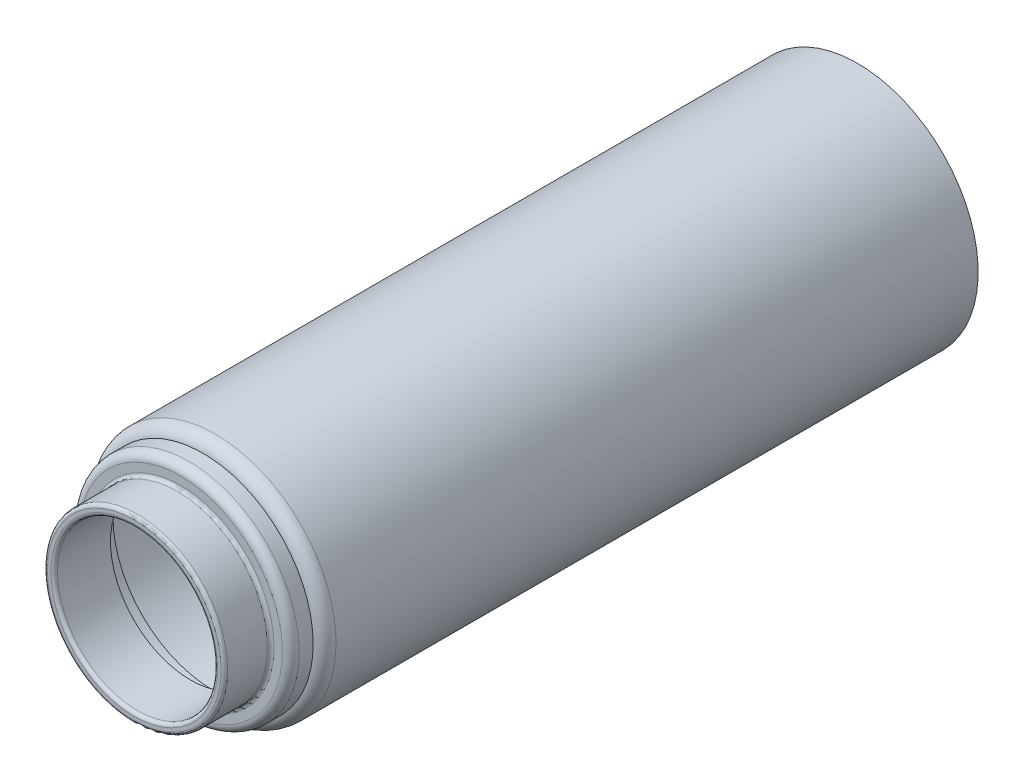
ISO-10303-21;
HEADER;
FILE_DESCRIPTION(('STEP AP214'),'2;1');
FILE_NAME('part.step','',(''),(''),'','','');
FILE_SCHEMA(('AUTOMOTIVE_DESIGN { 1 0 10303 214 1 1 1 1 }'));
ENDSEC;
DATA;
#1=APPLICATION_CONTEXT('core data for automotive mechanical design processes');
#2=APPLICATION_PROTOCOL_DEFINITION('international standard','automotive_design',2000,#1);
#3=PRODUCT_CONTEXT('',#1,'mechanical');
#4=PRODUCT('Part','Part','',(#3));
#5=PRODUCT_RELATED_PRODUCT_CATEGORY('part','',(#4));
#6=PRODUCT_DEFINITION_FORMATION('','',#4);
#7=PRODUCT_DEFINITION_CONTEXT('part definition',#1,'design');
#8=PRODUCT_DEFINITION('design','',#6,#7);
#9=PRODUCT_DEFINITION_SHAPE('','',#8);
#10=(LENGTH_UNIT() NAMED_UNIT(*) SI_UNIT(.MILLI.,.METRE.));
#11=(NAMED_UNIT(*) PLANE_ANGLE_UNIT() SI_UNIT($,.RADIAN.));
#12=(NAMED_UNIT(*) SI_UNIT($,.STERADIAN.) SOLID_ANGLE_UNIT());
#13=UNCERTAINTY_MEASURE_WITH_UNIT(LENGTH_MEASURE(1.E-05),#10,'distance_accuracy_value','');
#14=(GEOMETRIC_REPRESENTATION_CONTEXT(3) GLOBAL_UNCERTAINTY_ASSIGNED_CONTEXT((#13)) GLOBAL_UNIT_ASSIGNED_CONTEXT((#10,
#11,#12)) REPRESENTATION_CONTEXT('',''));
#15=CARTESIAN_POINT('',(0.,0.,0.));
#16=DIRECTION('',(0.,0.,1.));
#17=DIRECTION('',(1.,0.,0.));
#18=AXIS2_PLACEMENT_3D('',#15,#16,#17);
#19=CARTESIAN_POINT('',(0.,0.,197.64375));
#20=DIRECTION('',(0.,0.,-1.));
#21=DIRECTION('',(-1.,0.,0.));
#22=AXIS2_PLACEMENT_3D('',#19,#20,#21);
#23=CYLINDRICAL_SURFACE('',#22,36.40455);
#24=CARTESIAN_POINT('',(0.,0.,193.894823794071));
#25=DIRECTION('',(0.,0.,1.));
#26=DIRECTION('',(1.,0.,0.));
#27=AXIS2_PLACEMENT_3D('',#24,#25,#26);
#28=CIRCLE('',#27,36.40455);
#29=CARTESIAN_POINT('',(-36.40455,0.,193.894823794071));
#30=VERTEX_POINT('',#29);
#31=EDGE_CURVE('E64',#30,#30,#28,.F.);
#32=CARTESIAN_POINT('',(0.,0.,0.));
#33=DIRECTION('',(0.,0.,1.));
#34=DIRECTION('',(1.,0.,0.));
#35=AXIS2_PLACEMENT_3D('',#32,#33,#34);
#36=CIRCLE('',#35,36.40455);
#37=CARTESIAN_POINT('',(-36.40455,0.,0.));
#38=VERTEX_POINT('',#37);
#39=EDGE_CURVE('E68',#38,#38,#36,.T.);
#40=CARTESIAN_POINT('',(-36.40455,0.,193.894823794071));
#41=CARTESIAN_POINT('',(-36.40455,0.,191.875086046216));
#42=CARTESIAN_POINT('',(-36.40455,0.,189.855348298361));
#43=CARTESIAN_POINT('',(-36.40455,0.,185.815872802652));
#44=CARTESIAN_POINT('',(-36.40455,0.,183.796135054797));
#45=CARTESIAN_POINT('',(-36.40455,0.,179.756659559087));
#46=CARTESIAN_POINT('',(-36.40455,0.,177.736921811232));
#47=CARTESIAN_POINT('',(-36.40455,0.,173.697446315522));
#48=CARTESIAN_POINT('',(-36.40455,0.,171.677708567667));
#49=CARTESIAN_POINT('',(-36.40455,0.,167.638233071957));
#50=CARTESIAN_POINT('',(-36.40455,0.,165.618495324102));
#51=CARTESIAN_POINT('',(-36.40455,0.,161.579019828393));
#52=CARTESIAN_POINT('',(-36.40455,0.,159.559282080538));
#53=CARTESIAN_POINT('',(-36.40455,0.,155.519806584828));
#54=CARTESIAN_POINT('',(-36.40455,0.,153.500068836973));
#55=CARTESIAN_POINT('',(-36.40455,0.,149.460593341263));
#56=CARTESIAN_POINT('',(-36.40455,0.,147.440855593408));
#57=CARTESIAN_POINT('',(-36.40455,0.,143.401380097698));
#58=CARTESIAN_POINT('',(-36.40455,0.,141.381642349844));
#59=CARTESIAN_POINT('',(-36.40455,0.,137.342166854134));
#60=CARTESIAN_POINT('',(-36.40455,0.,135.322429106279));
#61=CARTESIAN_POINT('',(-36.40455,0.,131.282953610569));
#62=CARTESIAN_POINT('',(-36.40455,0.,129.263215862714));
#63=CARTESIAN_POINT('',(-36.40455,0.,125.223740367004));
#64=CARTESIAN_POINT('',(-36.40455,0.,123.204002619149));
#65=CARTESIAN_POINT('',(-36.40455,0.,119.16452712344));
#66=CARTESIAN_POINT('',(-36.40455,0.,117.144789375585));
#67=CARTESIAN_POINT('',(-36.40455,0.,113.105313879875));
#68=CARTESIAN_POINT('',(-36.40455,0.,111.08557613202));
#69=CARTESIAN_POINT('',(-36.40455,0.,107.04610063631));
#70=CARTESIAN_POINT('',(-36.40455,0.,105.026362888455));
#71=CARTESIAN_POINT('',(-36.40455,0.,100.986887392745));
#72=CARTESIAN_POINT('',(-36.40455,0.,98.9671496448905));
#73=CARTESIAN_POINT('',(-36.40455,0.,94.9276741491807));
#74=CARTESIAN_POINT('',(-36.40455,0.,92.9079364013257));
#75=CARTESIAN_POINT('',(-36.40455,0.,88.8684609056159));
#76=CARTESIAN_POINT('',(-36.40455,0.,86.848723157761));
#77=CARTESIAN_POINT('',(-36.40455,0.,82.8092476620512));
#78=CARTESIAN_POINT('',(-36.40455,0.,80.7895099141963));
#79=CARTESIAN_POINT('',(-36.40455,0.,76.7500344184865));
#80=CARTESIAN_POINT('',(-36.40455,0.,74.7302966706316));
#81=CARTESIAN_POINT('',(-36.40455,0.,70.6908211749218));
#82=CARTESIAN_POINT('',(-36.40455,0.,68.6710834270669));
#83=CARTESIAN_POINT('',(-36.40455,0.,64.6316079313571));
#84=CARTESIAN_POINT('',(-36.40455,0.,62.6118701835021));
#85=CARTESIAN_POINT('',(-36.40455,0.,58.5723946877923));
#86=CARTESIAN_POINT('',(-36.40455,0.,56.5526569399374));
#87=CARTESIAN_POINT('',(-36.40455,0.,52.5131814442276));
#88=CARTESIAN_POINT('',(-36.40455,0.,50.4934436963727));
#89=CARTESIAN_POINT('',(-36.40455,0.,46.4539682006629));
#90=CARTESIAN_POINT('',(-36.40455,0.,44.434230452808));
#91=CARTESIAN_POINT('',(-36.40455,0.,40.3947549570981));
#92=CARTESIAN_POINT('',(-36.40455,0.,38.3750172092432));
#93=CARTESIAN_POINT('',(-36.40455,0.,34.3355417135334));
#94=CARTESIAN_POINT('',(-36.40455,0.,32.3158039656785));
#95=CARTESIAN_POINT('',(-36.40455,0.,28.2763284699687));
#96=CARTESIAN_POINT('',(-36.40455,0.,26.2565907221138));
#97=CARTESIAN_POINT('',(-36.40455,0.,22.217115226404));
#98=CARTESIAN_POINT('',(-36.40455,0.,20.1973774785491));
#99=CARTESIAN_POINT('',(-36.40455,0.,16.1579019828393));
#100=CARTESIAN_POINT('',(-36.40455,0.,14.1381642349843));
#101=CARTESIAN_POINT('',(-36.40455,0.,10.0986887392745));
#102=CARTESIAN_POINT('',(-36.40455,0.,8.07895099141961));
#103=CARTESIAN_POINT('',(-36.40455,0.,4.03947549570979));
#104=CARTESIAN_POINT('',(-36.40455,0.,2.01973774785488));
#105=CARTESIAN_POINT('',(-36.40455,0.,0.));
#106=B_SPLINE_CURVE_WITH_KNOTS('',3,(#40,#41,#42,#43,#44,#45,#46,#47,#48,#49,#50,#51,#52,#53,
#54,#55,#56,#57,#58,#59,#60,#61,#62,#63,#64,#65,#66,#67,#68,#69,#70,#71,#72,#73,#74,#75,#76,#77,
#78,#79,#80,#81,#82,#83,#84,#85,#86,#87,#88,#89,#90,#91,#92,#93,#94,#95,#96,#97,#98,#99,#100,
#101,#102,#103,#104,#105),.UNSPECIFIED.,.F.,.F.,(4,2,2,2,2,2,2,2,2,2,2,2,2,2,2,2,2,2,2,2,2,2,2,
2,2,2,2,2,2,2,2,2,4),(0.,6.05921324356473,12.1184264871295,18.1776397306942,24.2368529742589,
30.2960662178236,36.3552794613884,42.4144927049531,48.4737059485178,54.5329191920825,
60.5921324356472,66.651345679212,72.7105589227767,78.7697721663414,84.8289854099062,
90.8881986534709,96.9474118970356,103.0066251406,109.065838384165,115.12505162773,
121.184264871294,127.243478114859,133.302691358424,139.361904601989,145.421117845553,
151.480331089118,157.539544332683,163.598757576248,169.657970819812,175.717184063377,
181.776397306942,187.835610550506,193.894823794071),.UNSPECIFIED.);
#107=EDGE_CURVE('BSEAM32',#30,#38,#106,.T.);
#108=ORIENTED_EDGE('',*,*,#31,.T.);
#109=ORIENTED_EDGE('',*,*,#39,.T.);
#110=ORIENTED_EDGE('',*,*,#107,.T.);
#111=ORIENTED_EDGE('',*,*,#107,.F.);
#112=EDGE_LOOP('',(#108,#110,#109,#111));
#113=FACE_BOUND('',#112,.T.);
#114=ADVANCED_FACE('F32',(#113),#23,.T.);
#115=CARTESIAN_POINT('',(0.,0.,0.));
#116=DIRECTION('',(0.,0.,1.));
#117=DIRECTION('',(1.,0.,0.));
#118=AXIS2_PLACEMENT_3D('',#115,#116,#117);
#119=PLANE('',#118);
#120=ORIENTED_EDGE('',*,*,#39,.F.);
#121=EDGE_LOOP('',(#120));
#122=FACE_BOUND('',#121,.T.);
#123=ADVANCED_FACE('F107',(#122),#119,.F.);
#124=CARTESIAN_POINT('',(0.,0.,204.42555));
#125=DIRECTION('',(0.,0.,-1.));
#126=DIRECTION('',(-1.,0.,0.));
#127=AXIS2_PLACEMENT_3D('',#124,#125,#126);
#128=CYLINDRICAL_SURFACE('',#127,33.274);
#129=CARTESIAN_POINT('',(0.,0.,201.88555));
#130=DIRECTION('',(0.,0.,1.));
#131=DIRECTION('',(1.,0.,0.));
#132=AXIS2_PLACEMENT_3D('',#129,#130,#131);
#133=CIRCLE('',#132,33.274);
#134=CARTESIAN_POINT('',(-33.274,0.,201.88555));
#135=VERTEX_POINT('',#134);
#136=EDGE_CURVE('E58',#135,#135,#133,.F.);
#137=CARTESIAN_POINT('',(0.,0.,197.64375));
#138=DIRECTION('',(0.,0.,1.));
#139=DIRECTION('',(1.,0.,0.));
#140=AXIS2_PLACEMENT_3D('',#137,#138,#139);
#141=CIRCLE('',#140,33.274);
#142=CARTESIAN_POINT('',(-33.274,0.,197.64375));
#143=VERTEX_POINT('',#142);
#144=EDGE_CURVE('E67',#143,#143,#141,.T.);
#145=CARTESIAN_POINT('',(-33.274,0.,201.88555));
#146=CARTESIAN_POINT('',(-33.274,0.,201.841364583333));
#147=CARTESIAN_POINT('',(-33.274,0.,201.797179166667));
#148=CARTESIAN_POINT('',(-33.274,0.,201.708808333333));
#149=CARTESIAN_POINT('',(-33.274,0.,201.664622916667));
#150=CARTESIAN_POINT('',(-33.274,0.,201.576252083333));
#151=CARTESIAN_POINT('',(-33.274,0.,201.532066666667));
#152=CARTESIAN_POINT('',(-33.274,0.,201.443695833333));
#153=CARTESIAN_POINT('',(-33.274,0.,201.399510416667));
#154=CARTESIAN_POINT('',(-33.274,0.,201.311139583333));
#155=CARTESIAN_POINT('',(-33.274,0.,201.266954166667));
#156=CARTESIAN_POINT('',(-33.274,0.,201.178583333333));
#157=CARTESIAN_POINT('',(-33.274,0.,201.134397916667));
#158=CARTESIAN_POINT('',(-33.274,0.,201.046027083333));
#159=CARTESIAN_POINT('',(-33.274,0.,201.001841666667));
#160=CARTESIAN_POINT('',(-33.274,0.,200.913470833333));
#161=CARTESIAN_POINT('',(-33.274,0.,200.869285416667));
#162=CARTESIAN_POINT('',(-33.274,0.,200.780914583333));
#163=CARTESIAN_POINT('',(-33.274,0.,200.736729166667));
#164=CARTESIAN_POINT('',(-33.274,0.,200.648358333333));
#165=CARTESIAN_POINT('',(-33.274,0.,200.604172916667));
#166=CARTESIAN_POINT('',(-33.274,0.,200.515802083333));
#167=CARTESIAN_POINT('',(-33.274,0.,200.471616666667));
#168=CARTESIAN_POINT('',(-33.274,0.,200.383245833333));
#169=CARTESIAN_POINT('',(-33.274,0.,200.339060416667));
#170=CARTESIAN_POINT('',(-33.274,0.,200.250689583333));
#171=CARTESIAN_POINT('',(-33.274,0.,200.206504166667));
#172=CARTESIAN_POINT('',(-33.274,0.,200.118133333333));
#173=CARTESIAN_POINT('',(-33.274,0.,200.073947916667));
#174=CARTESIAN_POINT('',(-33.274,0.,199.985577083333));
#175=CARTESIAN_POINT('',(-33.274,0.,199.941391666667));
#176=CARTESIAN_POINT('',(-33.274,0.,199.853020833333));
#177=CARTESIAN_POINT('',(-33.274,0.,199.808835416667));
#178=CARTESIAN_POINT('',(-33.274,0.,199.720464583333));
#179=CARTESIAN_POINT('',(-33.274,0.,199.676279166667));
#180=CARTESIAN_POINT('',(-33.274,0.,199.587908333333));
#181=CARTESIAN_POINT('',(-33.274,0.,199.543722916667));
#182=CARTESIAN_POINT('',(-33.274,0.,199.455352083333));
#183=CARTESIAN_POINT('',(-33.274,0.,199.411166666667));
#184=CARTESIAN_POINT('',(-33.274,0.,199.322795833333));
#185=CARTESIAN_POINT('',(-33.274,0.,199.278610416667));
#186=CARTESIAN_POINT('',(-33.274,0.,199.190239583333));
#187=CARTESIAN_POINT('',(-33.274,0.,199.146054166667));
#188=CARTESIAN_POINT('',(-33.274,0.,199.057683333333));
#189=CARTESIAN_POINT('',(-33.274,0.,199.013497916667));
#190=CARTESIAN_POINT('',(-33.274,0.,198.925127083333));
#191=CARTESIAN_POINT('',(-33.274,0.,198.880941666667));
#192=CARTESIAN_POINT('',(-33.274,0.,198.792570833333));
#193=CARTESIAN_POINT('',(-33.274,0.,198.748385416667));
#194=CARTESIAN_POINT('',(-33.274,0.,198.660014583333));
#195=CARTESIAN_POINT('',(-33.274,0.,198.615829166667));
#196=CARTESIAN_POINT('',(-33.274,0.,198.527458333333));
#197=CARTESIAN_POINT('',(-33.274,0.,198.483272916667));
#198=CARTESIAN_POINT('',(-33.274,0.,198.394902083333));
#199=CARTESIAN_POINT('',(-33.274,0.,198.350716666667));
#200=CARTESIAN_POINT('',(-33.274,0.,198.262345833333));
#201=CARTESIAN_POINT('',(-33.274,0.,198.218160416667));
#202=CARTESIAN_POINT('',(-33.274,0.,198.129789583333));
#203=CARTESIAN_POINT('',(-33.274,0.,198.085604166667));
#204=CARTESIAN_POINT('',(-33.274,0.,197.997233333333));
#205=CARTESIAN_POINT('',(-33.274,0.,197.953047916667));
#206=CARTESIAN_POINT('',(-33.274,0.,197.864677083333));
#207=CARTESIAN_POINT('',(-33.274,0.,197.820491666667));
#208=CARTESIAN_POINT('',(-33.274,0.,197.732120833333));
#209=CARTESIAN_POINT('',(-33.274,0.,197.687935416667));
#210=CARTESIAN_POINT('',(-33.274,0.,197.64375));
#211=B_SPLINE_CURVE_WITH_KNOTS('',3,(#145,#146,#147,#148,#149,#150,#151,#152,#153,#154,#155,
#156,#157,#158,#159,#160,#161,#162,#163,#164,#165,#166,#167,#168,#169,#170,#171,#172,#173,#174,
#175,#176,#177,#178,#179,#180,#181,#182,#183,#184,#185,#186,#187,#188,#189,#190,#191,#192,#193,
#194,#195,#196,#197,#198,#199,#200,#201,#202,#203,#204,#205,#206,#207,#208,#209,#210),
.UNSPECIFIED.,.F.,.F.,(4,2,2,2,2,2,2,2,2,2,2,2,2,2,2,2,2,2,2,2,2,2,2,2,2,2,2,2,2,2,2,2,4),(0.,
0.132556249999999,0.265112499999998,0.397668749999996,0.530224999999995,0.662781249999994,
0.795337499999993,0.927893749999992,1.06044999999999,1.19300624999999,1.32556249999999,
1.45811874999999,1.59067499999999,1.72323124999998,1.85578749999998,1.98834374999998,
2.12090000000001,2.25345625000001,2.38601250000001,2.51856875000001,2.651125,2.78368125,
2.9162375,3.04879375,3.18135,3.31390625,3.4464625,3.57901875,3.71157499999999,3.84413124999999,
3.97668749999999,4.10924374999999,4.24180000000002),.UNSPECIFIED.);
#212=EDGE_CURVE('BSEAM113',#135,#143,#211,.T.);
#213=ORIENTED_EDGE('',*,*,#136,.T.);
#214=ORIENTED_EDGE('',*,*,#144,.T.);
#215=ORIENTED_EDGE('',*,*,#212,.T.);
#216=ORIENTED_EDGE('',*,*,#212,.F.);
#217=EDGE_LOOP('',(#213,#215,#214,#216));
#218=FACE_BOUND('',#217,.T.);
#219=ADVANCED_FACE('F113',(#218),#128,.T.);
#220=CARTESIAN_POINT('',(0.,0.,204.42555));
#221=DIRECTION('',(0.,0.,1.));
#222=DIRECTION('',(1.,0.,0.));
#223=AXIS2_PLACEMENT_3D('',#220,#221,#222);
#224=PLANE('',#223);
#225=CARTESIAN_POINT('',(0.,0.,204.42555));
#226=DIRECTION('',(0.,0.,1.));
#227=DIRECTION('',(1.,0.,0.));
#228=AXIS2_PLACEMENT_3D('',#225,#226,#227);
#229=CIRCLE('',#228,28.2288);
#230=CARTESIAN_POINT('',(28.2288,0.,204.42555));
#231=VERTEX_POINT('',#230);
#232=EDGE_CURVE('E52',#231,#231,#229,.F.);
#233=ORIENTED_EDGE('',*,*,#232,.T.);
#234=EDGE_LOOP('',(#233));
#235=FACE_BOUND('',#234,.T.);
#236=CARTESIAN_POINT('',(0.,0.,204.42555));
#237=DIRECTION('',(0.,0.,1.));
#238=DIRECTION('',(1.,0.,0.));
#239=AXIS2_PLACEMENT_3D('',#236,#237,#238);
#240=CIRCLE('',#239,30.734);
#241=CARTESIAN_POINT('',(30.734,0.,204.42555));
#242=VERTEX_POINT('',#241);
#243=EDGE_CURVE('E61',#242,#242,#240,.T.);
#244=ORIENTED_EDGE('',*,*,#243,.T.);
#245=EDGE_LOOP('',(#244));
#246=FACE_BOUND('',#245,.T.);
#247=ADVANCED_FACE('F150',(#235,#246),#224,.T.);
#248=CARTESIAN_POINT('',(0.,0.,218.39555));
#249=DIRECTION('',(0.,0.,-1.));
#250=DIRECTION('',(-1.,0.,0.));
#251=AXIS2_PLACEMENT_3D('',#248,#249,#250);
#252=CYLINDRICAL_SURFACE('',#251,27.2288);
#253=CARTESIAN_POINT('',(0.,0.,217.395549968));
#254=DIRECTION('',(0.,0.,1.));
#255=DIRECTION('',(1.,0.,0.));
#256=AXIS2_PLACEMENT_3D('',#253,#254,#255);
#257=CIRCLE('',#256,27.2288);
#258=CARTESIAN_POINT('',(27.2288,0.,217.395549968));
#259=VERTEX_POINT('',#258);
#260=EDGE_CURVE('E39',#259,#259,#257,.F.);
#261=ORIENTED_EDGE('',*,*,#260,.T.);
#262=EDGE_LOOP('',(#261));
#263=FACE_BOUND('',#262,.T.);
#264=CARTESIAN_POINT('',(0.,0.,205.42555));
#265=DIRECTION('',(0.,0.,1.));
#266=DIRECTION('',(1.,0.,0.));
#267=AXIS2_PLACEMENT_3D('',#264,#265,#266);
#268=CIRCLE('',#267,27.2288);
#269=CARTESIAN_POINT('',(27.2288,0.,205.42555));
#270=VERTEX_POINT('',#269);
#271=EDGE_CURVE('E55',#270,#270,#268,.T.);
#272=ORIENTED_EDGE('',*,*,#271,.T.);
#273=EDGE_LOOP('',(#272));
#274=FACE_BOUND('',#273,.T.);
#275=ADVANCED_FACE('F143',(#263,#274),#252,.T.);
#276=CARTESIAN_POINT('',(0.,0.,218.39555));
#277=DIRECTION('',(0.,0.,1.));
#278=DIRECTION('',(1.,0.,0.));
#279=AXIS2_PLACEMENT_3D('',#276,#277,#278);
#280=PLANE('',#279);
#281=CARTESIAN_POINT('',(0.,0.,218.39555));
#282=DIRECTION('',(0.,0.,1.));
#283=DIRECTION('',(1.,0.,0.));
#284=AXIS2_PLACEMENT_3D('',#281,#282,#283);
#285=CIRCLE('',#284,26.228799968);
#286=CARTESIAN_POINT('',(26.228799968,0.,218.39555));
#287=VERTEX_POINT('',#286);
#288=EDGE_CURVE('E43',#287,#287,#285,.T.);
#289=ORIENTED_EDGE('',*,*,#288,.T.);
#290=EDGE_LOOP('',(#289));
#291=FACE_BOUND('',#290,.T.);
#292=CARTESIAN_POINT('',(0.,0.,218.39555));
#293=DIRECTION('',(0.,0.,1.));
#294=DIRECTION('',(1.,0.,0.));
#295=AXIS2_PLACEMENT_3D('',#292,#293,#294);
#296=CIRCLE('',#295,25.180800032);
#297=CARTESIAN_POINT('',(25.180800032,0.,218.39555));
#298=VERTEX_POINT('',#297);
#299=EDGE_CURVE('E47',#298,#298,#296,.F.);
#300=ORIENTED_EDGE('',*,*,#299,.T.);
#301=EDGE_LOOP('',(#300));
#302=FACE_BOUND('',#301,.T.);
#303=ADVANCED_FACE('F104',(#291,#302),#280,.T.);
#304=CARTESIAN_POINT('',(0.,0.,197.64375));
#305=DIRECTION('',(0.,0.,-1.));
#306=DIRECTION('',(-1.,0.,0.));
#307=AXIS2_PLACEMENT_3D('',#304,#305,#306);
#308=CYLINDRICAL_SURFACE('',#307,33.35655);
#309=CARTESIAN_POINT('',(0.,0.,194.59575));
#310=DIRECTION('',(0.,0.,1.));
#311=DIRECTION('',(1.,0.,0.));
#312=AXIS2_PLACEMENT_3D('',#309,#310,#311);
#313=CIRCLE('',#312,33.35655);
#314=CARTESIAN_POINT('',(-33.35655,0.,194.59575));
#315=VERTEX_POINT('',#314);
#316=EDGE_CURVE('E83',#315,#315,#313,.T.);
#317=CARTESIAN_POINT('',(0.,0.,3.048));
#318=DIRECTION('',(0.,0.,1.));
#319=DIRECTION('',(1.,0.,0.));
#320=AXIS2_PLACEMENT_3D('',#317,#318,#319);
#321=CIRCLE('',#320,33.35655);
#322=CARTESIAN_POINT('',(-33.35655,0.,3.04799999999997));
#323=VERTEX_POINT('',#322);
#324=EDGE_CURVE('E80',#323,#323,#321,.T.);
#325=CARTESIAN_POINT('',(-33.35655,0.,194.59575));
#326=CARTESIAN_POINT('',(-33.35655,0.,192.6004609375));
#327=CARTESIAN_POINT('',(-33.35655,0.,190.605171875));
#328=CARTESIAN_POINT('',(-33.35655,0.,186.61459375));
#329=CARTESIAN_POINT('',(-33.35655,0.,184.6193046875));
#330=CARTESIAN_POINT('',(-33.35655,0.,180.6287265625));
#331=CARTESIAN_POINT('',(-33.35655,0.,178.6334375));
#332=CARTESIAN_POINT('',(-33.35655,0.,174.642859375));
#333=CARTESIAN_POINT('',(-33.35655,0.,172.6475703125));
#334=CARTESIAN_POINT('',(-33.35655,0.,168.6569921875));
#335=CARTESIAN_POINT('',(-33.35655,0.,166.661703125));
#336=CARTESIAN_POINT('',(-33.35655,0.,162.671125));
#337=CARTESIAN_POINT('',(-33.35655,0.,160.6758359375));
#338=CARTESIAN_POINT('',(-33.35655,0.,156.6852578125));
#339=CARTESIAN_POINT('',(-33.35655,0.,154.68996875));
#340=CARTESIAN_POINT('',(-33.35655,0.,150.699390625));
#341=CARTESIAN_POINT('',(-33.35655,0.,148.7041015625));
#342=CARTESIAN_POINT('',(-33.35655,0.,144.7135234375));
#343=CARTESIAN_POINT('',(-33.35655,0.,142.718234375));
#344=CARTESIAN_POINT('',(-33.35655,0.,138.72765625));
#345=CARTESIAN_POINT('',(-33.35655,0.,136.7323671875));
#346=CARTESIAN_POINT('',(-33.35655,0.,132.7417890625));
#347=CARTESIAN_POINT('',(-33.35655,0.,130.7465));
#348=CARTESIAN_POINT('',(-33.35655,0.,126.755921875));
#349=CARTESIAN_POINT('',(-33.35655,0.,124.7606328125));
#350=CARTESIAN_POINT('',(-33.35655,0.,120.7700546875));
#351=CARTESIAN_POINT('',(-33.35655,0.,118.774765625));
#352=CARTESIAN_POINT('',(-33.35655,0.,114.7841875));
#353=CARTESIAN_POINT('',(-33.35655,0.,112.7888984375));
#354=CARTESIAN_POINT('',(-33.35655,0.,108.7983203125));
#355=CARTESIAN_POINT('',(-33.35655,0.,106.80303125));
#356=CARTESIAN_POINT('',(-33.35655,0.,102.812453125));
#357=CARTESIAN_POINT('',(-33.35655,0.,100.8171640625));
#358=CARTESIAN_POINT('',(-33.35655,0.,96.8265859375));
#359=CARTESIAN_POINT('',(-33.35655,0.,94.831296875));
#360=CARTESIAN_POINT('',(-33.35655,0.,90.84071875));
#361=CARTESIAN_POINT('',(-33.35655,0.,88.8454296875));
#362=CARTESIAN_POINT('',(-33.35655,0.,84.8548515625));
#363=CARTESIAN_POINT('',(-33.35655,0.,82.8595625));
#364=CARTESIAN_POINT('',(-33.35655,0.,78.868984375));
#365=CARTESIAN_POINT('',(-33.35655,0.,76.8736953125));
#366=CARTESIAN_POINT('',(-33.35655,0.,72.8831171875));
#367=CARTESIAN_POINT('',(-33.35655,0.,70.887828125));
#368=CARTESIAN_POINT('',(-33.35655,0.,66.89725));
#369=CARTESIAN_POINT('',(-33.35655,0.,64.9019609375));
#370=CARTESIAN_POINT('',(-33.35655,0.,60.9113828125));
#371=CARTESIAN_POINT('',(-33.35655,0.,58.91609375));
#372=CARTESIAN_POINT('',(-33.35655,0.,54.925515625));
#373=CARTESIAN_POINT('',(-33.35655,0.,52.9302265625));
#374=CARTESIAN_POINT('',(-33.35655,0.,48.9396484375));
#375=CARTESIAN_POINT('',(-33.35655,0.,46.944359375));
#376=CARTESIAN_POINT('',(-33.35655,0.,42.95378125));
#377=CARTESIAN_POINT('',(-33.35655,0.,40.9584921875));
#378=CARTESIAN_POINT('',(-33.35655,0.,36.9679140625));
#379=CARTESIAN_POINT('',(-33.35655,0.,34.972625));
#380=CARTESIAN_POINT('',(-33.35655,0.,30.982046875));
#381=CARTESIAN_POINT('',(-33.35655,0.,28.9867578125));
#382=CARTESIAN_POINT('',(-33.35655,0.,24.9961796875));
#383=CARTESIAN_POINT('',(-33.35655,0.,23.000890625));
#384=CARTESIAN_POINT('',(-33.35655,0.,19.0103125));
#385=CARTESIAN_POINT('',(-33.35655,0.,17.0150234375));
#386=CARTESIAN_POINT('',(-33.35655,0.,13.0244453125));
#387=CARTESIAN_POINT('',(-33.35655,0.,11.02915625));
#388=CARTESIAN_POINT('',(-33.35655,0.,7.03857812499996));
#389=CARTESIAN_POINT('',(-33.35655,0.,5.04328906249996));
#390=CARTESIAN_POINT('',(-33.35655,0.,3.04799999999997));
#391=B_SPLINE_CURVE_WITH_KNOTS('',3,(#325,#326,#327,#328,#329,#330,#331,#332,#333,#334,#335,
#336,#337,#338,#339,#340,#341,#342,#343,#344,#345,#346,#347,#348,#349,#350,#351,#352,#353,#354,
#355,#356,#357,#358,#359,#360,#361,#362,#363,#364,#365,#366,#367,#368,#369,#370,#371,#372,#373,
#374,#375,#376,#377,#378,#379,#380,#381,#382,#383,#384,#385,#386,#387,#388,#389,#390),
.UNSPECIFIED.,.F.,.F.,(4,2,2,2,2,2,2,2,2,2,2,2,2,2,2,2,2,2,2,2,2,2,2,2,2,2,2,2,2,2,2,2,4),(0.,
5.98586718749999,11.971734375,17.9576015625,23.94346875,29.9293359375,35.915203125,
41.9010703125,47.8869375,53.8728046875,59.858671875,65.8445390625,71.83040625,77.8162734375,
83.802140625,89.7880078125,95.773875,101.7597421875,107.745609375,113.7314765625,119.71734375,
125.7032109375,131.689078125,137.6749453125,143.6608125,149.6466796875,155.632546875,
161.6184140625,167.60428125,173.5901484375,179.576015625,185.5618828125,191.54775),.UNSPECIFIED.);
#392=EDGE_CURVE('BSEAM89',#315,#323,#391,.T.);
#393=ORIENTED_EDGE('',*,*,#316,.T.);
#394=ORIENTED_EDGE('',*,*,#324,.F.);
#395=ORIENTED_EDGE('',*,*,#392,.T.);
#396=ORIENTED_EDGE('',*,*,#392,.F.);
#397=EDGE_LOOP('',(#393,#395,#394,#396));
#398=FACE_BOUND('',#397,.T.);
#399=ADVANCED_FACE('F89',(#398),#308,.F.);
#400=CARTESIAN_POINT('',(0.,0.,194.59575));
#401=DIRECTION('',(0.,0.,1.));
#402=DIRECTION('',(1.,0.,0.));
#403=AXIS2_PLACEMENT_3D('',#400,#401,#402);
#404=PLANE('',#403);
#405=CARTESIAN_POINT('',(0.,0.,194.59575));
#406=DIRECTION('',(0.,0.,1.));
#407=DIRECTION('',(1.,0.,0.));
#408=AXIS2_PLACEMENT_3D('',#405,#406,#407);
#409=CIRCLE('',#408,30.226);
#410=CARTESIAN_POINT('',(-30.226,0.,194.59575));
#411=VERTEX_POINT('',#410);
#412=EDGE_CURVE('E76',#411,#411,#409,.T.);
#413=ORIENTED_EDGE('',*,*,#412,.T.);
#414=EDGE_LOOP('',(#413));
#415=FACE_BOUND('',#414,.T.);
#416=ORIENTED_EDGE('',*,*,#316,.F.);
#417=EDGE_LOOP('',(#416));
#418=FACE_BOUND('',#417,.T.);
#419=ADVANCED_FACE('F92',(#415,#418),#404,.F.);
#420=CARTESIAN_POINT('',(0.,0.,3.048));
#421=DIRECTION('',(0.,0.,1.));
#422=DIRECTION('',(1.,0.,0.));
#423=AXIS2_PLACEMENT_3D('',#420,#421,#422);
#424=PLANE('',#423);
#425=ORIENTED_EDGE('',*,*,#324,.T.);
#426=EDGE_LOOP('',(#425));
#427=FACE_BOUND('',#426,.T.);
#428=ADVANCED_FACE('F94',(#427),#424,.T.);
#429=CARTESIAN_POINT('',(0.,0.,204.42555));
#430=DIRECTION('',(0.,0.,-1.));
#431=DIRECTION('',(-1.,0.,0.));
#432=AXIS2_PLACEMENT_3D('',#429,#430,#431);
#433=CYLINDRICAL_SURFACE('',#432,30.226);
#434=CARTESIAN_POINT('',(0.,0.,201.37755));
#435=DIRECTION('',(0.,0.,1.));
#436=DIRECTION('',(1.,0.,0.));
#437=AXIS2_PLACEMENT_3D('',#434,#435,#436);
#438=CIRCLE('',#437,30.226);
#439=CARTESIAN_POINT('',(-30.226,0.,201.37755));
#440=VERTEX_POINT('',#439);
#441=EDGE_CURVE('E77',#440,#440,#438,.T.);
#442=CARTESIAN_POINT('',(-30.226,0.,201.37755));
#443=CARTESIAN_POINT('',(-30.226,0.,201.30690625));
#444=CARTESIAN_POINT('',(-30.226,0.,201.2362625));
#445=CARTESIAN_POINT('',(-30.226,0.,201.094975));
#446=CARTESIAN_POINT('',(-30.226,0.,201.02433125));
#447=CARTESIAN_POINT('',(-30.226,0.,200.88304375));
#448=CARTESIAN_POINT('',(-30.226,0.,200.8124));
#449=CARTESIAN_POINT('',(-30.226,0.,200.6711125));
#450=CARTESIAN_POINT('',(-30.226,0.,200.60046875));
#451=CARTESIAN_POINT('',(-30.226,0.,200.45918125));
#452=CARTESIAN_POINT('',(-30.226,0.,200.3885375));
#453=CARTESIAN_POINT('',(-30.226,0.,200.24725));
#454=CARTESIAN_POINT('',(-30.226,0.,200.17660625));
#455=CARTESIAN_POINT('',(-30.226,0.,200.03531875));
#456=CARTESIAN_POINT('',(-30.226,0.,199.964675));
#457=CARTESIAN_POINT('',(-30.226,0.,199.8233875));
#458=CARTESIAN_POINT('',(-30.226,0.,199.75274375));
#459=CARTESIAN_POINT('',(-30.226,0.,199.61145625));
#460=CARTESIAN_POINT('',(-30.226,0.,199.5408125));
#461=CARTESIAN_POINT('',(-30.226,0.,199.399525));
#462=CARTESIAN_POINT('',(-30.226,0.,199.32888125));
#463=CARTESIAN_POINT('',(-30.226,0.,199.18759375));
#464=CARTESIAN_POINT('',(-30.226,0.,199.11695));
#465=CARTESIAN_POINT('',(-30.226,0.,198.9756625));
#466=CARTESIAN_POINT('',(-30.226,0.,198.90501875));
#467=CARTESIAN_POINT('',(-30.226,0.,198.76373125));
#468=CARTESIAN_POINT('',(-30.226,0.,198.6930875));
#469=CARTESIAN_POINT('',(-30.226,0.,198.5518));
#470=CARTESIAN_POINT('',(-30.226,0.,198.48115625));
#471=CARTESIAN_POINT('',(-30.226,0.,198.33986875));
#472=CARTESIAN_POINT('',(-30.226,0.,198.269225));
#473=CARTESIAN_POINT('',(-30.226,0.,198.1279375));
#474=CARTESIAN_POINT('',(-30.226,0.,198.05729375));
#475=CARTESIAN_POINT('',(-30.226,0.,197.91600625));
#476=CARTESIAN_POINT('',(-30.226,0.,197.8453625));
#477=CARTESIAN_POINT('',(-30.226,0.,197.704075));
#478=CARTESIAN_POINT('',(-30.226,0.,197.63343125));
#479=CARTESIAN_POINT('',(-30.226,0.,197.49214375));
#480=CARTESIAN_POINT('',(-30.226,0.,197.4215));
#481=CARTESIAN_POINT('',(-30.226,0.,197.2802125));
#482=CARTESIAN_POINT('',(-30.226,0.,197.20956875));
#483=CARTESIAN_POINT('',(-30.226,0.,197.06828125));
#484=CARTESIAN_POINT('',(-30.226,0.,196.9976375));
#485=CARTESIAN_POINT('',(-30.226,0.,196.85635));
#486=CARTESIAN_POINT('',(-30.226,0.,196.78570625));
#487=CARTESIAN_POINT('',(-30.226,0.,196.64441875));
#488=CARTESIAN_POINT('',(-30.226,0.,196.573775));
#489=CARTESIAN_POINT('',(-30.226,0.,196.4324875));
#490=CARTESIAN_POINT('',(-30.226,0.,196.36184375));
#491=CARTESIAN_POINT('',(-30.226,0.,196.22055625));
#492=CARTESIAN_POINT('',(-30.226,0.,196.1499125));
#493=CARTESIAN_POINT('',(-30.226,0.,196.008625));
#494=CARTESIAN_POINT('',(-30.226,0.,195.93798125));
#495=CARTESIAN_POINT('',(-30.226,0.,195.79669375));
#496=CARTESIAN_POINT('',(-30.226,0.,195.72605));
#497=CARTESIAN_POINT('',(-30.226,0.,195.5847625));
#498=CARTESIAN_POINT('',(-30.226,0.,195.51411875));
#499=CARTESIAN_POINT('',(-30.226,0.,195.37283125));
#500=CARTESIAN_POINT('',(-30.226,0.,195.3021875));
#501=CARTESIAN_POINT('',(-30.226,0.,195.1609));
#502=CARTESIAN_POINT('',(-30.226,0.,195.09025625));
#503=CARTESIAN_POINT('',(-30.226,0.,194.94896875));
#504=CARTESIAN_POINT('',(-30.226,0.,194.878325));
#505=CARTESIAN_POINT('',(-30.226,0.,194.7370375));
#506=CARTESIAN_POINT('',(-30.226,0.,194.66639375));
#507=CARTESIAN_POINT('',(-30.226,0.,194.59575));
#508=B_SPLINE_CURVE_WITH_KNOTS('',3,(#442,#443,#444,#445,#446,#447,#448,#449,#450,#451,#452,
#453,#454,#455,#456,#457,#458,#459,#460,#461,#462,#463,#464,#465,#466,#467,#468,#469,#470,#471,
#472,#473,#474,#475,#476,#477,#478,#479,#480,#481,#482,#483,#484,#485,#486,#487,#488,#489,#490,
#491,#492,#493,#494,#495,#496,#497,#498,#499,#500,#501,#502,#503,#504,#505,#506,#507),
.UNSPECIFIED.,.F.,.F.,(4,2,2,2,2,2,2,2,2,2,2,2,2,2,2,2,2,2,2,2,2,2,2,2,2,2,2,2,2,2,2,2,4),(0.,
0.211931249999991,0.423862499999983,0.635793749999974,0.847724999999994,1.05965624999999,
1.27158749999998,1.48351875,1.69544999999999,1.90738124999998,2.1193125,2.33124374999999,
2.54317499999998,2.75510625,2.96703749999999,3.17896874999998,3.3909,3.60283124999999,
3.81476249999999,4.02669375,4.238625,4.45055624999999,4.66248749999998,4.87441875,
5.08634999999999,5.29828124999998,5.5102125,5.72214374999999,5.93407499999998,6.14600625,
6.35793749999999,6.56986874999999,6.7818),.UNSPECIFIED.);
#509=EDGE_CURVE('BSEAM101',#440,#411,#508,.T.);
#510=ORIENTED_EDGE('',*,*,#441,.T.);
#511=ORIENTED_EDGE('',*,*,#412,.F.);
#512=ORIENTED_EDGE('',*,*,#509,.T.);
#513=ORIENTED_EDGE('',*,*,#509,.F.);
#514=EDGE_LOOP('',(#510,#512,#511,#513));
#515=FACE_BOUND('',#514,.T.);
#516=ADVANCED_FACE('F101',(#515),#433,.F.);
#517=CARTESIAN_POINT('',(0.,0.,201.37755));
#518=DIRECTION('',(0.,0.,1.));
#519=DIRECTION('',(1.,0.,0.));
#520=AXIS2_PLACEMENT_3D('',#517,#518,#519);
#521=PLANE('',#520);
#522=CARTESIAN_POINT('',(0.,0.,201.37755));
#523=DIRECTION('',(0.,0.,1.));
#524=DIRECTION('',(1.,0.,0.));
#525=AXIS2_PLACEMENT_3D('',#522,#523,#524);
#526=CIRCLE('',#525,24.1808);
#527=CARTESIAN_POINT('',(24.1808,0.,201.37755));
#528=VERTEX_POINT('',#527);
#529=EDGE_CURVE('E71',#528,#528,#526,.T.);
#530=ORIENTED_EDGE('',*,*,#529,.T.);
#531=EDGE_LOOP('',(#530));
#532=FACE_BOUND('',#531,.T.);
#533=ORIENTED_EDGE('',*,*,#441,.F.);
#534=EDGE_LOOP('',(#533));
#535=FACE_BOUND('',#534,.T.);
#536=ADVANCED_FACE('F196',(#532,#535),#521,.F.);
#537=CARTESIAN_POINT('',(0.,0.,218.39555));
#538=DIRECTION('',(0.,0.,-1.));
#539=DIRECTION('',(-1.,0.,0.));
#540=AXIS2_PLACEMENT_3D('',#537,#538,#539);
#541=CYLINDRICAL_SURFACE('',#540,24.1808);
#542=CARTESIAN_POINT('',(0.,0.,217.395549968));
#543=DIRECTION('',(0.,0.,1.));
#544=DIRECTION('',(1.,0.,0.));
#545=AXIS2_PLACEMENT_3D('',#542,#543,#544);
#546=CIRCLE('',#545,24.1808);
#547=CARTESIAN_POINT('',(24.1808,0.,217.395549968));
#548=VERTEX_POINT('',#547);
#549=EDGE_CURVE('E10',#548,#548,#546,.T.);
#550=ORIENTED_EDGE('',*,*,#549,.T.);
#551=EDGE_LOOP('',(#550));
#552=FACE_BOUND('',#551,.T.);
#553=ORIENTED_EDGE('',*,*,#529,.F.);
#554=EDGE_LOOP('',(#553));
#555=FACE_BOUND('',#554,.T.);
#556=ADVANCED_FACE('F123',(#552,#555),#541,.F.);
#557=CARTESIAN_POINT('',(0.,0.,193.894823794071));
#558=DIRECTION('',(0.,0.,1.));
#559=DIRECTION('',(1.,0.,0.));
#560=AXIS2_PLACEMENT_3D('',#557,#558,#559);
#561=TOROIDAL_SURFACE('',#560,32.59455,3.81);
#562=ORIENTED_EDGE('',*,*,#31,.F.);
#563=EDGE_LOOP('',(#562));
#564=FACE_BOUND('',#563,.T.);
#565=ORIENTED_EDGE('',*,*,#144,.F.);
#566=EDGE_LOOP('',(#565));
#567=FACE_BOUND('',#566,.T.);
#568=ADVANCED_FACE('F119',(#564,#567),#561,.T.);
#569=CARTESIAN_POINT('',(0.,0.,201.88555));
#570=DIRECTION('',(0.,0.,1.));
#571=DIRECTION('',(1.,0.,0.));
#572=AXIS2_PLACEMENT_3D('',#569,#570,#571);
#573=TOROIDAL_SURFACE('',#572,30.734,2.54);
#574=ORIENTED_EDGE('',*,*,#136,.F.);
#575=EDGE_LOOP('',(#574));
#576=FACE_BOUND('',#575,.T.);
#577=ORIENTED_EDGE('',*,*,#243,.F.);
#578=EDGE_LOOP('',(#577));
#579=FACE_BOUND('',#578,.T.);
#580=ADVANCED_FACE('F122',(#576,#579),#573,.T.);
#581=CARTESIAN_POINT('',(0.,0.,205.42555));
#582=DIRECTION('',(0.,0.,1.));
#583=DIRECTION('',(1.,0.,0.));
#584=AXIS2_PLACEMENT_3D('',#581,#582,#583);
#585=TOROIDAL_SURFACE('',#584,28.2288,1.);
#586=ORIENTED_EDGE('',*,*,#232,.F.);
#587=EDGE_LOOP('',(#586));
#588=FACE_BOUND('',#587,.T.);
#589=ORIENTED_EDGE('',*,*,#271,.F.);
#590=EDGE_LOOP('',(#589));
#591=FACE_BOUND('',#590,.T.);
#592=ADVANCED_FACE('F127',(#588,#591),#585,.F.);
#593=CARTESIAN_POINT('',(0.,0.,217.395549968));
#594=DIRECTION('',(0.,0.,1.));
#595=DIRECTION('',(1.,0.,0.));
#596=AXIS2_PLACEMENT_3D('',#593,#594,#595);
#597=TOROIDAL_SURFACE('',#596,26.228799968,1.000000032);
#598=ORIENTED_EDGE('',*,*,#260,.F.);
#599=EDGE_LOOP('',(#598));
#600=FACE_BOUND('',#599,.T.);
#601=ORIENTED_EDGE('',*,*,#288,.F.);
#602=EDGE_LOOP('',(#601));
#603=FACE_BOUND('',#602,.T.);
#604=ADVANCED_FACE('F130',(#600,#603),#597,.T.);
#605=CARTESIAN_POINT('',(0.,0.,217.395549968));
#606=DIRECTION('',(0.,0.,1.));
#607=DIRECTION('',(1.,0.,0.));
#608=AXIS2_PLACEMENT_3D('',#605,#606,#607);
#609=TOROIDAL_SURFACE('',#608,25.180800032,1.000000032);
#610=ORIENTED_EDGE('',*,*,#299,.F.);
#611=EDGE_LOOP('',(#610));
#612=FACE_BOUND('',#611,.T.);
#613=ORIENTED_EDGE('',*,*,#549,.F.);
#614=EDGE_LOOP('',(#613));
#615=FACE_BOUND('',#614,.T.);
#616=ADVANCED_FACE('F34',(#612,#615),#609,.T.);
#617=CLOSED_SHELL('',(#114,#123,#219,#247,#275,#303,#399,#419,#428,#516,#536,#556,#568,#580,
#592,#604,#616));
#618=MANIFOLD_SOLID_BREP('B2',#617);
#619=ADVANCED_BREP_SHAPE_REPRESENTATION('',(#18,#618),#14);
#620=SHAPE_DEFINITION_REPRESENTATION(#9,#619);
ENDSEC;
END-ISO-10303-21;
